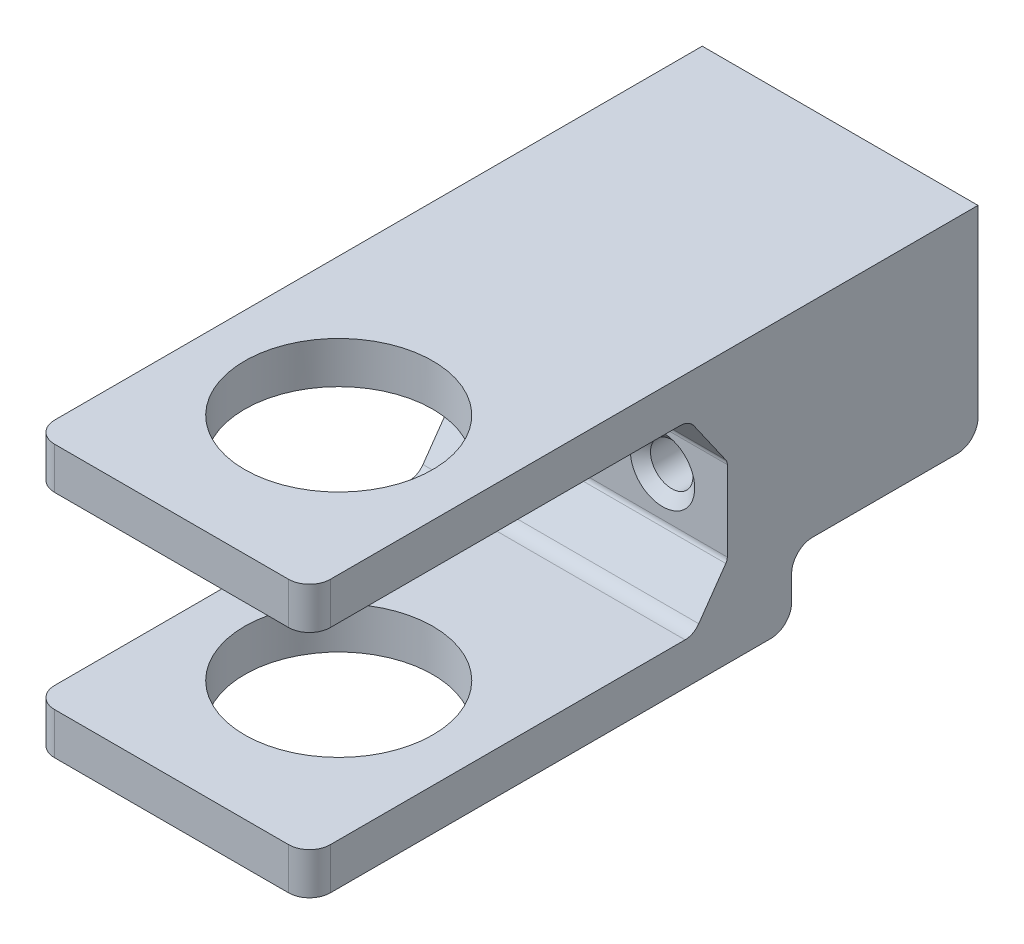
ISO-10303-21;
HEADER;
FILE_DESCRIPTION(('STEP AP214'),'2;1');
FILE_NAME('part.step','',(''),(''),'','','');
FILE_SCHEMA(('AUTOMOTIVE_DESIGN { 1 0 10303 214 1 1 1 1 }'));
ENDSEC;
DATA;
#1=APPLICATION_CONTEXT('core data for automotive mechanical design processes');
#2=APPLICATION_PROTOCOL_DEFINITION('international standard','automotive_design',2000,#1);
#3=PRODUCT_CONTEXT('',#1,'mechanical');
#4=PRODUCT('Part','Part','',(#3));
#5=PRODUCT_RELATED_PRODUCT_CATEGORY('part','',(#4));
#6=PRODUCT_DEFINITION_FORMATION('','',#4);
#7=PRODUCT_DEFINITION_CONTEXT('part definition',#1,'design');
#8=PRODUCT_DEFINITION('design','',#6,#7);
#9=PRODUCT_DEFINITION_SHAPE('','',#8);
#10=(LENGTH_UNIT() NAMED_UNIT(*) SI_UNIT(.MILLI.,.METRE.));
#11=(NAMED_UNIT(*) PLANE_ANGLE_UNIT() SI_UNIT($,.RADIAN.));
#12=(NAMED_UNIT(*) SI_UNIT($,.STERADIAN.) SOLID_ANGLE_UNIT());
#13=UNCERTAINTY_MEASURE_WITH_UNIT(LENGTH_MEASURE(1.E-05),#10,'distance_accuracy_value','');
#14=(GEOMETRIC_REPRESENTATION_CONTEXT(3) GLOBAL_UNCERTAINTY_ASSIGNED_CONTEXT((#13)) GLOBAL_UNIT_ASSIGNED_CONTEXT((#10,
#11,#12)) REPRESENTATION_CONTEXT('',''));
#15=CARTESIAN_POINT('',(0.,0.,0.));
#16=DIRECTION('',(0.,0.,1.));
#17=DIRECTION('',(1.,0.,0.));
#18=AXIS2_PLACEMENT_3D('',#15,#16,#17);
#19=CARTESIAN_POINT('',(20.955,41.275,50.8));
#20=DIRECTION('',(-1.,0.,0.));
#21=DIRECTION('',(0.,0.,1.));
#22=AXIS2_PLACEMENT_3D('',#19,#20,#21);
#23=PLANE('',#22);
#24=DIRECTION('',(0.,0.,-1.));
#25=VECTOR('',#24,1.);
#26=CARTESIAN_POINT('',(20.955,0.,50.8));
#27=LINE('',#26,#25);
#28=CARTESIAN_POINT('',(20.955,0.,47.625));
#29=VERTEX_POINT('',#28);
#30=CARTESIAN_POINT('',(20.955,0.,-19.304));
#31=VERTEX_POINT('',#30);
#32=EDGE_CURVE('E440',#29,#31,#27,.T.);
#33=ORIENTED_EDGE('',*,*,#32,.T.);
#34=CARTESIAN_POINT('',(20.955,3.175,-19.304));
#35=DIRECTION('',(-1.,0.,0.));
#36=DIRECTION('',(0.,0.,1.));
#37=AXIS2_PLACEMENT_3D('',#34,#35,#36);
#38=CIRCLE('',#37,3.175);
#39=CARTESIAN_POINT('',(20.955,3.175,-22.479));
#40=VERTEX_POINT('',#39);
#41=EDGE_CURVE('E279',#31,#40,#38,.F.);
#42=ORIENTED_EDGE('',*,*,#41,.T.);
#43=DIRECTION('',(0.,1.,0.));
#44=VECTOR('',#43,1.);
#45=CARTESIAN_POINT('',(20.955,0.,-22.479));
#46=LINE('',#45,#44);
#47=CARTESIAN_POINT('',(20.955,6.985,-22.479));
#48=VERTEX_POINT('',#47);
#49=EDGE_CURVE('E491',#40,#48,#46,.T.);
#50=ORIENTED_EDGE('',*,*,#49,.T.);
#51=CARTESIAN_POINT('',(20.955,6.985,-25.654));
#52=DIRECTION('',(-1.,0.,0.));
#53=DIRECTION('',(0.,0.,1.));
#54=AXIS2_PLACEMENT_3D('',#51,#52,#53);
#55=CIRCLE('',#54,3.175);
#56=CARTESIAN_POINT('',(20.955,10.16,-25.654));
#57=VERTEX_POINT('',#56);
#58=EDGE_CURVE('E328',#48,#57,#55,.T.);
#59=ORIENTED_EDGE('',*,*,#58,.T.);
#60=DIRECTION('',(0.,0.,-1.));
#61=VECTOR('',#60,1.);
#62=CARTESIAN_POINT('',(20.955,10.16,-50.8));
#63=LINE('',#62,#61);
#64=CARTESIAN_POINT('',(20.955,10.16,-47.625));
#65=VERTEX_POINT('',#64);
#66=EDGE_CURVE('E494',#57,#65,#63,.T.);
#67=ORIENTED_EDGE('',*,*,#66,.T.);
#68=CARTESIAN_POINT('',(20.955,13.335,-47.625));
#69=DIRECTION('',(-1.,0.,0.));
#70=DIRECTION('',(0.,0.,1.));
#71=AXIS2_PLACEMENT_3D('',#68,#69,#70);
#72=CIRCLE('',#71,3.175);
#73=CARTESIAN_POINT('',(20.955,13.335,-50.8));
#74=VERTEX_POINT('',#73);
#75=EDGE_CURVE('E227',#65,#74,#72,.F.);
#76=ORIENTED_EDGE('',*,*,#75,.T.);
#77=DIRECTION('',(0.,-1.,0.));
#78=VECTOR('',#77,1.);
#79=CARTESIAN_POINT('',(20.955,41.275,-50.8));
#80=LINE('',#79,#78);
#81=CARTESIAN_POINT('',(20.955,41.275,-50.8));
#82=VERTEX_POINT('',#81);
#83=EDGE_CURVE('E216',#82,#74,#80,.T.);
#84=ORIENTED_EDGE('',*,*,#83,.F.);
#85=DIRECTION('',(0.,0.,-1.));
#86=VECTOR('',#85,1.);
#87=CARTESIAN_POINT('',(20.955,41.275,50.8));
#88=LINE('',#87,#86);
#89=CARTESIAN_POINT('',(20.955,41.275,47.625));
#90=VERTEX_POINT('',#89);
#91=EDGE_CURVE('E196',#90,#82,#88,.T.);
#92=ORIENTED_EDGE('',*,*,#91,.F.);
#93=DIRECTION('',(0.,-1.,0.));
#94=VECTOR('',#93,1.);
#95=CARTESIAN_POINT('',(20.955,41.275,47.625));
#96=LINE('',#95,#94);
#97=CARTESIAN_POINT('',(20.955,34.925,47.625));
#98=VERTEX_POINT('',#97);
#99=EDGE_CURVE('E270',#90,#98,#96,.T.);
#100=ORIENTED_EDGE('',*,*,#99,.T.);
#101=DIRECTION('',(0.,0.,1.));
#102=VECTOR('',#101,1.);
#103=CARTESIAN_POINT('',(20.955,34.925,0.));
#104=LINE('',#103,#102);
#105=CARTESIAN_POINT('',(20.955,34.925,-5.55022309827195));
#106=VERTEX_POINT('',#105);
#107=EDGE_CURVE('E518',#106,#98,#104,.T.);
#108=ORIENTED_EDGE('',*,*,#107,.F.);
#109=CARTESIAN_POINT('',(20.955,32.385,-5.55022309827195));
#110=DIRECTION('',(-1.,0.,0.));
#111=DIRECTION('',(0.,0.,1.));
#112=AXIS2_PLACEMENT_3D('',#109,#110,#111);
#113=CIRCLE('',#112,2.54);
#114=CARTESIAN_POINT('',(20.955,33.8418841483317,-7.63086929076599));
#115=VERTEX_POINT('',#114);
#116=EDGE_CURVE('E367',#106,#115,#113,.T.);
#117=ORIENTED_EDGE('',*,*,#116,.T.);
#118=DIRECTION('',(0.,0.819152044288993,0.573576436351044));
#119=VECTOR('',#118,1.);
#120=CARTESIAN_POINT('',(20.955,14.7189748221115,-21.020874553486));
#121=LINE('',#120,#119);
#122=CARTESIAN_POINT('',(20.955,26.9304278423133,-12.470323096247));
#123=VERTEX_POINT('',#122);
#124=EDGE_CURVE('E425',#123,#115,#121,.T.);
#125=ORIENTED_EDGE('',*,*,#124,.F.);
#126=CARTESIAN_POINT('',(20.955,26.2019857681475,-11.43));
#127=DIRECTION('',(-1.,0.,0.));
#128=DIRECTION('',(0.,0.,1.));
#129=AXIS2_PLACEMENT_3D('',#126,#127,#128);
#130=CIRCLE('',#129,1.27);
#131=CARTESIAN_POINT('',(20.955,26.2019857681475,-12.7));
#132=VERTEX_POINT('',#131);
#133=EDGE_CURVE('E11',#123,#132,#130,.T.);
#134=ORIENTED_EDGE('',*,*,#133,.T.);
#135=DIRECTION('',(0.,-1.,0.));
#136=VECTOR('',#135,1.);
#137=CARTESIAN_POINT('',(20.955,0.,-12.7));
#138=LINE('',#137,#136);
#139=CARTESIAN_POINT('',(20.955,14.0326911356055,-12.7));
#140=VERTEX_POINT('',#139);
#141=EDGE_CURVE('E395',#132,#140,#138,.T.);
#142=ORIENTED_EDGE('',*,*,#141,.T.);
#143=CARTESIAN_POINT('',(20.955,14.0326911356055,-11.43));
#144=DIRECTION('',(-1.,0.,0.));
#145=DIRECTION('',(0.,0.,1.));
#146=AXIS2_PLACEMENT_3D('',#143,#144,#145);
#147=CIRCLE('',#146,1.27);
#148=CARTESIAN_POINT('',(20.955,13.3042490614396,-12.470323096247));
#149=VERTEX_POINT('',#148);
#150=EDGE_CURVE('E387',#140,#149,#147,.T.);
#151=ORIENTED_EDGE('',*,*,#150,.T.);
#152=DIRECTION('',(0.,-0.819152044288993,0.573576436351044));
#153=VECTOR('',#152,1.);
#154=CARTESIAN_POINT('',(20.955,-1.4821713508769,-2.11676006040512));
#155=LINE('',#154,#153);
#156=CARTESIAN_POINT('',(20.955,7.43311585166835,-8.35931136493182));
#157=VERTEX_POINT('',#156);
#158=EDGE_CURVE('E393',#149,#157,#155,.T.);
#159=ORIENTED_EDGE('',*,*,#158,.T.);
#160=CARTESIAN_POINT('',(20.955,8.89,-6.27866517243778));
#161=DIRECTION('',(-1.,0.,0.));
#162=DIRECTION('',(0.,0.,1.));
#163=AXIS2_PLACEMENT_3D('',#160,#161,#162);
#164=CIRCLE('',#163,2.54);
#165=CARTESIAN_POINT('',(20.955,6.35,-6.27866517243778));
#166=VERTEX_POINT('',#165);
#167=EDGE_CURVE('E361',#157,#166,#164,.T.);
#168=ORIENTED_EDGE('',*,*,#167,.T.);
#169=DIRECTION('',(0.,0.,1.));
#170=VECTOR('',#169,1.);
#171=CARTESIAN_POINT('',(20.955,6.35,0.));
#172=LINE('',#171,#170);
#173=CARTESIAN_POINT('',(20.955,6.35,47.625));
#174=VERTEX_POINT('',#173);
#175=EDGE_CURVE('E405',#166,#174,#172,.T.);
#176=ORIENTED_EDGE('',*,*,#175,.T.);
#177=DIRECTION('',(0.,-1.,0.));
#178=VECTOR('',#177,1.);
#179=CARTESIAN_POINT('',(20.955,41.275,47.625));
#180=LINE('',#179,#178);
#181=EDGE_CURVE('E273',#174,#29,#180,.T.);
#182=ORIENTED_EDGE('',*,*,#181,.T.);
#183=EDGE_LOOP('',(#33,#42,#50,#59,#67,#76,#84,#92,#100,#108,#117,#125,#134,#142,#151,#159,#168,
#176,#182));
#184=FACE_BOUND('',#183,.T.);
#185=ADVANCED_FACE('F43',(#184),#23,.F.);
#186=CARTESIAN_POINT('',(-20.955,41.275,50.8));
#187=DIRECTION('',(1.,0.,0.));
#188=DIRECTION('',(0.,0.,-1.));
#189=AXIS2_PLACEMENT_3D('',#186,#187,#188);
#190=PLANE('',#189);
#191=DIRECTION('',(0.,1.,0.));
#192=VECTOR('',#191,1.);
#193=CARTESIAN_POINT('',(-20.955,0.,-22.479));
#194=LINE('',#193,#192);
#195=CARTESIAN_POINT('',(-20.955,3.175,-22.479));
#196=VERTEX_POINT('',#195);
#197=CARTESIAN_POINT('',(-20.955,6.985,-22.479));
#198=VERTEX_POINT('',#197);
#199=EDGE_CURVE('E481',#196,#198,#194,.T.);
#200=ORIENTED_EDGE('',*,*,#199,.F.);
#201=CARTESIAN_POINT('',(-20.955,3.175,-19.304));
#202=DIRECTION('',(1.,0.,0.));
#203=DIRECTION('',(0.,0.,-1.));
#204=AXIS2_PLACEMENT_3D('',#201,#202,#203);
#205=CIRCLE('',#204,3.175);
#206=CARTESIAN_POINT('',(-20.955,0.,-19.304));
#207=VERTEX_POINT('',#206);
#208=EDGE_CURVE('E258',#196,#207,#205,.F.);
#209=ORIENTED_EDGE('',*,*,#208,.T.);
#210=DIRECTION('',(0.,0.,1.));
#211=VECTOR('',#210,1.);
#212=CARTESIAN_POINT('',(-20.955,0.,50.8));
#213=LINE('',#212,#211);
#214=CARTESIAN_POINT('',(-20.955,0.,47.625));
#215=VERTEX_POINT('',#214);
#216=EDGE_CURVE('E451',#207,#215,#213,.T.);
#217=ORIENTED_EDGE('',*,*,#216,.T.);
#218=DIRECTION('',(0.,-1.,0.));
#219=VECTOR('',#218,1.);
#220=CARTESIAN_POINT('',(-20.955,41.275,47.625));
#221=LINE('',#220,#219);
#222=CARTESIAN_POINT('',(-20.955,6.35,47.625));
#223=VERTEX_POINT('',#222);
#224=EDGE_CURVE('E251',#215,#223,#221,.F.);
#225=ORIENTED_EDGE('',*,*,#224,.T.);
#226=DIRECTION('',(0.,0.,1.));
#227=VECTOR('',#226,1.);
#228=CARTESIAN_POINT('',(-20.955,6.35,0.));
#229=LINE('',#228,#227);
#230=CARTESIAN_POINT('',(-20.955,6.35,-6.27866517243778));
#231=VERTEX_POINT('',#230);
#232=EDGE_CURVE('E420',#231,#223,#229,.T.);
#233=ORIENTED_EDGE('',*,*,#232,.F.);
#234=CARTESIAN_POINT('',(-20.955,8.89,-6.27866517243778));
#235=DIRECTION('',(1.,0.,0.));
#236=DIRECTION('',(0.,0.,-1.));
#237=AXIS2_PLACEMENT_3D('',#234,#235,#236);
#238=CIRCLE('',#237,2.54);
#239=CARTESIAN_POINT('',(-20.955,7.43311585166835,-8.35931136493182));
#240=VERTEX_POINT('',#239);
#241=EDGE_CURVE('E357',#231,#240,#238,.T.);
#242=ORIENTED_EDGE('',*,*,#241,.T.);
#243=DIRECTION('',(0.,-0.819152044288993,0.573576436351044));
#244=VECTOR('',#243,1.);
#245=CARTESIAN_POINT('',(-20.955,-1.4821713508769,-2.11676006040512));
#246=LINE('',#245,#244);
#247=CARTESIAN_POINT('',(-20.955,13.3042490614396,-12.470323096247));
#248=VERTEX_POINT('',#247);
#249=EDGE_CURVE('E412',#248,#240,#246,.T.);
#250=ORIENTED_EDGE('',*,*,#249,.F.);
#251=CARTESIAN_POINT('',(-20.955,14.0326911356055,-11.43));
#252=DIRECTION('',(1.,0.,0.));
#253=DIRECTION('',(0.,0.,-1.));
#254=AXIS2_PLACEMENT_3D('',#251,#252,#253);
#255=CIRCLE('',#254,1.27);
#256=CARTESIAN_POINT('',(-20.955,14.0326911356055,-12.7));
#257=VERTEX_POINT('',#256);
#258=EDGE_CURVE('E384',#248,#257,#255,.T.);
#259=ORIENTED_EDGE('',*,*,#258,.T.);
#260=DIRECTION('',(0.,-1.,0.));
#261=VECTOR('',#260,1.);
#262=CARTESIAN_POINT('',(-20.955,0.,-12.7));
#263=LINE('',#262,#261);
#264=CARTESIAN_POINT('',(-20.955,26.2019857681475,-12.7));
#265=VERTEX_POINT('',#264);
#266=EDGE_CURVE('E411',#265,#257,#263,.T.);
#267=ORIENTED_EDGE('',*,*,#266,.F.);
#268=CARTESIAN_POINT('',(-20.955,26.2019857681475,-11.43));
#269=DIRECTION('',(1.,0.,0.));
#270=DIRECTION('',(0.,0.,-1.));
#271=AXIS2_PLACEMENT_3D('',#268,#269,#270);
#272=CIRCLE('',#271,1.27);
#273=CARTESIAN_POINT('',(-20.955,26.9304278423133,-12.470323096247));
#274=VERTEX_POINT('',#273);
#275=EDGE_CURVE('E52',#265,#274,#272,.T.);
#276=ORIENTED_EDGE('',*,*,#275,.T.);
#277=DIRECTION('',(0.,0.819152044288993,0.573576436351044));
#278=VECTOR('',#277,1.);
#279=CARTESIAN_POINT('',(-20.955,14.7189748221115,-21.020874553486));
#280=LINE('',#279,#278);
#281=CARTESIAN_POINT('',(-20.955,33.8418841483317,-7.63086929076599));
#282=VERTEX_POINT('',#281);
#283=EDGE_CURVE('E433',#274,#282,#280,.T.);
#284=ORIENTED_EDGE('',*,*,#283,.T.);
#285=CARTESIAN_POINT('',(-20.955,32.385,-5.55022309827195));
#286=DIRECTION('',(1.,0.,0.));
#287=DIRECTION('',(0.,0.,-1.));
#288=AXIS2_PLACEMENT_3D('',#285,#286,#287);
#289=CIRCLE('',#288,2.54);
#290=CARTESIAN_POINT('',(-20.955,34.925,-5.55022309827195));
#291=VERTEX_POINT('',#290);
#292=EDGE_CURVE('E364',#282,#291,#289,.T.);
#293=ORIENTED_EDGE('',*,*,#292,.T.);
#294=DIRECTION('',(0.,0.,1.));
#295=VECTOR('',#294,1.);
#296=CARTESIAN_POINT('',(-20.955,34.925,0.));
#297=LINE('',#296,#295);
#298=CARTESIAN_POINT('',(-20.955,34.925,47.625));
#299=VERTEX_POINT('',#298);
#300=EDGE_CURVE('E430',#291,#299,#297,.T.);
#301=ORIENTED_EDGE('',*,*,#300,.T.);
#302=DIRECTION('',(0.,-1.,0.));
#303=VECTOR('',#302,1.);
#304=CARTESIAN_POINT('',(-20.955,41.275,47.625));
#305=LINE('',#304,#303);
#306=CARTESIAN_POINT('',(-20.955,41.275,47.625));
#307=VERTEX_POINT('',#306);
#308=EDGE_CURVE('E248',#299,#307,#305,.F.);
#309=ORIENTED_EDGE('',*,*,#308,.T.);
#310=DIRECTION('',(0.,0.,1.));
#311=VECTOR('',#310,1.);
#312=CARTESIAN_POINT('',(-20.955,41.275,50.8));
#313=LINE('',#312,#311);
#314=CARTESIAN_POINT('',(-20.955,41.275,-50.8));
#315=VERTEX_POINT('',#314);
#316=EDGE_CURVE('E222',#315,#307,#313,.T.);
#317=ORIENTED_EDGE('',*,*,#316,.F.);
#318=DIRECTION('',(0.,-1.,0.));
#319=VECTOR('',#318,1.);
#320=CARTESIAN_POINT('',(-20.955,41.275,-50.8));
#321=LINE('',#320,#319);
#322=CARTESIAN_POINT('',(-20.955,13.335,-50.8));
#323=VERTEX_POINT('',#322);
#324=EDGE_CURVE('E219',#315,#323,#321,.T.);
#325=ORIENTED_EDGE('',*,*,#324,.T.);
#326=CARTESIAN_POINT('',(-20.955,13.335,-47.625));
#327=DIRECTION('',(1.,0.,0.));
#328=DIRECTION('',(0.,0.,-1.));
#329=AXIS2_PLACEMENT_3D('',#326,#327,#328);
#330=CIRCLE('',#329,3.175);
#331=CARTESIAN_POINT('',(-20.955,10.16,-47.625));
#332=VERTEX_POINT('',#331);
#333=EDGE_CURVE('E255',#323,#332,#330,.F.);
#334=ORIENTED_EDGE('',*,*,#333,.T.);
#335=DIRECTION('',(0.,0.,-1.));
#336=VECTOR('',#335,1.);
#337=CARTESIAN_POINT('',(-20.955,10.16,-50.8));
#338=LINE('',#337,#336);
#339=CARTESIAN_POINT('',(-20.955,10.16,-25.654));
#340=VERTEX_POINT('',#339);
#341=EDGE_CURVE('E495',#340,#332,#338,.T.);
#342=ORIENTED_EDGE('',*,*,#341,.F.);
#343=CARTESIAN_POINT('',(-20.955,6.985,-25.654));
#344=DIRECTION('',(1.,0.,0.));
#345=DIRECTION('',(0.,0.,-1.));
#346=AXIS2_PLACEMENT_3D('',#343,#344,#345);
#347=CIRCLE('',#346,3.175);
#348=EDGE_CURVE('E325',#340,#198,#347,.T.);
#349=ORIENTED_EDGE('',*,*,#348,.T.);
#350=EDGE_LOOP('',(#200,#209,#217,#225,#233,#242,#250,#259,#267,#276,#284,#293,#301,#309,#317,
#325,#334,#342,#349));
#351=FACE_BOUND('',#350,.T.);
#352=ADVANCED_FACE('F410',(#351),#190,.F.);
#353=CARTESIAN_POINT('',(-20.955,41.275,50.8));
#354=DIRECTION('',(0.,0.,-1.));
#355=DIRECTION('',(-1.,0.,0.));
#356=AXIS2_PLACEMENT_3D('',#353,#354,#355);
#357=PLANE('',#356);
#358=DIRECTION('',(1.,0.,0.));
#359=VECTOR('',#358,1.);
#360=CARTESIAN_POINT('',(-20.955,41.275,50.8));
#361=LINE('',#360,#359);
#362=CARTESIAN_POINT('',(-17.78,41.275,50.8));
#363=VERTEX_POINT('',#362);
#364=CARTESIAN_POINT('',(17.78,41.275,50.8));
#365=VERTEX_POINT('',#364);
#366=EDGE_CURVE('E235',#363,#365,#361,.T.);
#367=ORIENTED_EDGE('',*,*,#366,.F.);
#368=DIRECTION('',(0.,-1.,0.));
#369=VECTOR('',#368,1.);
#370=CARTESIAN_POINT('',(-17.78,41.275,50.8));
#371=LINE('',#370,#369);
#372=CARTESIAN_POINT('',(-17.78,34.925,50.8));
#373=VERTEX_POINT('',#372);
#374=EDGE_CURVE('E309',#363,#373,#371,.T.);
#375=ORIENTED_EDGE('',*,*,#374,.T.);
#376=DIRECTION('',(-1.,0.,0.));
#377=VECTOR('',#376,1.);
#378=CARTESIAN_POINT('',(20.955,34.925,50.8));
#379=LINE('',#378,#377);
#380=CARTESIAN_POINT('',(17.78,34.925,50.8));
#381=VERTEX_POINT('',#380);
#382=EDGE_CURVE('E436',#381,#373,#379,.T.);
#383=ORIENTED_EDGE('',*,*,#382,.F.);
#384=DIRECTION('',(0.,-1.,0.));
#385=VECTOR('',#384,1.);
#386=CARTESIAN_POINT('',(17.78,41.275,50.8));
#387=LINE('',#386,#385);
#388=EDGE_CURVE('E306',#381,#365,#387,.F.);
#389=ORIENTED_EDGE('',*,*,#388,.T.);
#390=EDGE_LOOP('',(#367,#375,#383,#389));
#391=FACE_BOUND('',#390,.T.);
#392=ADVANCED_FACE('F542',(#391),#357,.F.);
#393=CARTESIAN_POINT('',(-20.955,41.275,-50.8));
#394=DIRECTION('',(0.,0.,1.));
#395=DIRECTION('',(1.,0.,0.));
#396=AXIS2_PLACEMENT_3D('',#393,#394,#395);
#397=PLANE('',#396);
#398=CARTESIAN_POINT('',(-11.1125,20.6375,-50.8));
#399=DIRECTION('',(0.,0.,-1.));
#400=DIRECTION('',(-1.,0.,0.));
#401=AXIS2_PLACEMENT_3D('',#398,#399,#400);
#402=CIRCLE('',#401,3.2258);
#403=CARTESIAN_POINT('',(-14.3383,20.6375,-50.8));
#404=VERTEX_POINT('',#403);
#405=EDGE_CURVE('E507',#404,#404,#402,.T.);
#406=ORIENTED_EDGE('',*,*,#405,.F.);
#407=EDGE_LOOP('',(#406));
#408=FACE_BOUND('',#407,.T.);
#409=CARTESIAN_POINT('',(11.1125,20.6375,-50.8));
#410=DIRECTION('',(0.,0.,-1.));
#411=DIRECTION('',(-1.,0.,0.));
#412=AXIS2_PLACEMENT_3D('',#409,#410,#411);
#413=CIRCLE('',#412,3.2258);
#414=CARTESIAN_POINT('',(7.88669999999999,20.6375,-50.8));
#415=VERTEX_POINT('',#414);
#416=EDGE_CURVE('E336',#415,#415,#413,.T.);
#417=ORIENTED_EDGE('',*,*,#416,.F.);
#418=EDGE_LOOP('',(#417));
#419=FACE_BOUND('',#418,.T.);
#420=ORIENTED_EDGE('',*,*,#83,.T.);
#421=DIRECTION('',(-1.,0.,0.));
#422=VECTOR('',#421,1.);
#423=CARTESIAN_POINT('',(-20.955,13.335,-50.8));
#424=LINE('',#423,#422);
#425=EDGE_CURVE('E289',#74,#323,#424,.T.);
#426=ORIENTED_EDGE('',*,*,#425,.T.);
#427=ORIENTED_EDGE('',*,*,#324,.F.);
#428=DIRECTION('',(-1.,0.,0.));
#429=VECTOR('',#428,1.);
#430=CARTESIAN_POINT('',(-20.955,41.275,-50.8));
#431=LINE('',#430,#429);
#432=EDGE_CURVE('E200',#82,#315,#431,.T.);
#433=ORIENTED_EDGE('',*,*,#432,.F.);
#434=EDGE_LOOP('',(#420,#426,#427,#433));
#435=FACE_BOUND('',#434,.T.);
#436=ADVANCED_FACE('F214',(#408,#419,#435),#397,.F.);
#437=DIRECTION('',(-1.,0.,0.));
#438=VECTOR('',#437,1.);
#439=CARTESIAN_POINT('',(20.955,6.35,50.8));
#440=LINE('',#439,#438);
#441=CARTESIAN_POINT('',(17.78,6.35,50.8));
#442=VERTEX_POINT('',#441);
#443=CARTESIAN_POINT('',(-17.78,6.35,50.8));
#444=VERTEX_POINT('',#443);
#445=EDGE_CURVE('E441',#442,#444,#440,.T.);
#446=ORIENTED_EDGE('',*,*,#445,.T.);
#447=DIRECTION('',(0.,-1.,0.));
#448=VECTOR('',#447,1.);
#449=CARTESIAN_POINT('',(-17.78,41.275,50.8));
#450=LINE('',#449,#448);
#451=CARTESIAN_POINT('',(-17.78,0.,50.8));
#452=VERTEX_POINT('',#451);
#453=EDGE_CURVE('E295',#444,#452,#450,.T.);
#454=ORIENTED_EDGE('',*,*,#453,.T.);
#455=DIRECTION('',(1.,0.,0.));
#456=VECTOR('',#455,1.);
#457=CARTESIAN_POINT('',(-20.955,0.,50.8));
#458=LINE('',#457,#456);
#459=CARTESIAN_POINT('',(17.78,0.,50.8));
#460=VERTEX_POINT('',#459);
#461=EDGE_CURVE('E210',#452,#460,#458,.T.);
#462=ORIENTED_EDGE('',*,*,#461,.T.);
#463=DIRECTION('',(0.,-1.,0.));
#464=VECTOR('',#463,1.);
#465=CARTESIAN_POINT('',(17.78,41.275,50.8));
#466=LINE('',#465,#464);
#467=EDGE_CURVE('E292',#460,#442,#466,.F.);
#468=ORIENTED_EDGE('',*,*,#467,.T.);
#469=EDGE_LOOP('',(#446,#454,#462,#468));
#470=FACE_BOUND('',#469,.T.);
#471=ADVANCED_FACE('F459',(#470),#357,.F.);
#472=CARTESIAN_POINT('',(0.,41.275,0.));
#473=DIRECTION('',(0.,-1.,0.));
#474=DIRECTION('',(0.,0.,-1.));
#475=AXIS2_PLACEMENT_3D('',#472,#473,#474);
#476=PLANE('',#475);
#477=CARTESIAN_POINT('',(0.,41.275,25.4));
#478=DIRECTION('',(0.,1.,0.));
#479=DIRECTION('',(0.,0.,1.));
#480=AXIS2_PLACEMENT_3D('',#477,#478,#479);
#481=CIRCLE('',#480,14.3002);
#482=CARTESIAN_POINT('',(0.,41.275,39.7002));
#483=VERTEX_POINT('',#482);
#484=EDGE_CURVE('E499',#483,#483,#481,.T.);
#485=ORIENTED_EDGE('',*,*,#484,.F.);
#486=EDGE_LOOP('',(#485));
#487=FACE_BOUND('',#486,.T.);
#488=ORIENTED_EDGE('',*,*,#316,.T.);
#489=CARTESIAN_POINT('',(-17.78,41.275,47.625));
#490=DIRECTION('',(0.,-1.,0.));
#491=DIRECTION('',(0.,0.,-1.));
#492=AXIS2_PLACEMENT_3D('',#489,#490,#491);
#493=CIRCLE('',#492,3.175);
#494=EDGE_CURVE('E322',#307,#363,#493,.F.);
#495=ORIENTED_EDGE('',*,*,#494,.T.);
#496=ORIENTED_EDGE('',*,*,#366,.T.);
#497=CARTESIAN_POINT('',(17.78,41.275,47.625));
#498=DIRECTION('',(0.,-1.,0.));
#499=DIRECTION('',(0.,0.,-1.));
#500=AXIS2_PLACEMENT_3D('',#497,#498,#499);
#501=CIRCLE('',#500,3.175);
#502=EDGE_CURVE('E204',#365,#90,#501,.F.);
#503=ORIENTED_EDGE('',*,*,#502,.T.);
#504=ORIENTED_EDGE('',*,*,#91,.T.);
#505=ORIENTED_EDGE('',*,*,#432,.T.);
#506=EDGE_LOOP('',(#488,#495,#496,#503,#504,#505));
#507=FACE_BOUND('',#506,.T.);
#508=ADVANCED_FACE('F199',(#487,#507),#476,.F.);
#509=CARTESIAN_POINT('',(0.,0.,0.));
#510=DIRECTION('',(0.,-1.,0.));
#511=DIRECTION('',(0.,0.,-1.));
#512=AXIS2_PLACEMENT_3D('',#509,#510,#511);
#513=PLANE('',#512);
#514=ORIENTED_EDGE('',*,*,#216,.F.);
#515=DIRECTION('',(-1.,0.,0.));
#516=VECTOR('',#515,1.);
#517=CARTESIAN_POINT('',(20.955,0.,-19.304));
#518=LINE('',#517,#516);
#519=EDGE_CURVE('E267',#207,#31,#518,.F.);
#520=ORIENTED_EDGE('',*,*,#519,.T.);
#521=ORIENTED_EDGE('',*,*,#32,.F.);
#522=CARTESIAN_POINT('',(17.78,0.,47.625));
#523=DIRECTION('',(0.,-1.,0.));
#524=DIRECTION('',(0.,0.,-1.));
#525=AXIS2_PLACEMENT_3D('',#522,#523,#524);
#526=CIRCLE('',#525,3.175);
#527=EDGE_CURVE('E261',#29,#460,#526,.T.);
#528=ORIENTED_EDGE('',*,*,#527,.T.);
#529=ORIENTED_EDGE('',*,*,#461,.F.);
#530=CARTESIAN_POINT('',(-17.78,0.,47.625));
#531=DIRECTION('',(0.,-1.,0.));
#532=DIRECTION('',(0.,0.,-1.));
#533=AXIS2_PLACEMENT_3D('',#530,#531,#532);
#534=CIRCLE('',#533,3.175);
#535=EDGE_CURVE('E264',#452,#215,#534,.T.);
#536=ORIENTED_EDGE('',*,*,#535,.T.);
#537=EDGE_LOOP('',(#514,#520,#521,#528,#529,#536));
#538=FACE_BOUND('',#537,.T.);
#539=CARTESIAN_POINT('',(0.,0.,25.4));
#540=DIRECTION('',(0.,1.,0.));
#541=DIRECTION('',(0.,0.,1.));
#542=AXIS2_PLACEMENT_3D('',#539,#540,#541);
#543=CIRCLE('',#542,14.3002);
#544=CARTESIAN_POINT('',(0.,0.,39.7002));
#545=VERTEX_POINT('',#544);
#546=EDGE_CURVE('E243',#545,#545,#543,.T.);
#547=ORIENTED_EDGE('',*,*,#546,.T.);
#548=EDGE_LOOP('',(#547));
#549=FACE_BOUND('',#548,.T.);
#550=ADVANCED_FACE('F476',(#538,#549),#513,.T.);
#551=CARTESIAN_POINT('',(20.955,0.,-12.7));
#552=DIRECTION('',(0.,0.,-1.));
#553=DIRECTION('',(0.,1.,0.));
#554=AXIS2_PLACEMENT_3D('',#551,#552,#553);
#555=PLANE('',#554);
#556=CARTESIAN_POINT('',(-11.1125,20.6375,-12.7));
#557=DIRECTION('',(0.,0.,1.));
#558=DIRECTION('',(1.,0.,0.));
#559=AXIS2_PLACEMENT_3D('',#556,#557,#558);
#560=CIRCLE('',#559,4.8895);
#561=CARTESIAN_POINT('',(-6.22300000000001,20.6375,-12.7));
#562=VERTEX_POINT('',#561);
#563=EDGE_CURVE('E342',#562,#562,#560,.T.);
#564=ORIENTED_EDGE('',*,*,#563,.F.);
#565=EDGE_LOOP('',(#564));
#566=FACE_BOUND('',#565,.T.);
#567=CARTESIAN_POINT('',(11.1125,20.6375,-12.7));
#568=DIRECTION('',(0.,0.,1.));
#569=DIRECTION('',(1.,0.,0.));
#570=AXIS2_PLACEMENT_3D('',#567,#568,#569);
#571=CIRCLE('',#570,4.8895);
#572=CARTESIAN_POINT('',(16.002,20.6375,-12.7));
#573=VERTEX_POINT('',#572);
#574=EDGE_CURVE('E337',#573,#573,#571,.T.);
#575=ORIENTED_EDGE('',*,*,#574,.F.);
#576=EDGE_LOOP('',(#575));
#577=FACE_BOUND('',#576,.T.);
#578=ORIENTED_EDGE('',*,*,#266,.T.);
#579=DIRECTION('',(-1.,0.,0.));
#580=VECTOR('',#579,1.);
#581=CARTESIAN_POINT('',(20.955,14.0326911356055,-12.7));
#582=LINE('',#581,#580);
#583=EDGE_CURVE('E379',#257,#140,#582,.F.);
#584=ORIENTED_EDGE('',*,*,#583,.T.);
#585=ORIENTED_EDGE('',*,*,#141,.F.);
#586=DIRECTION('',(-1.,0.,0.));
#587=VECTOR('',#586,1.);
#588=CARTESIAN_POINT('',(20.955,26.2019857681475,-12.7));
#589=LINE('',#588,#587);
#590=EDGE_CURVE('E375',#132,#265,#589,.T.);
#591=ORIENTED_EDGE('',*,*,#590,.T.);
#592=EDGE_LOOP('',(#578,#584,#585,#591));
#593=FACE_BOUND('',#592,.T.);
#594=ADVANCED_FACE('F414',(#566,#577,#593),#555,.F.);
#595=CARTESIAN_POINT('',(20.955,14.7189748221115,-21.020874553486));
#596=DIRECTION('',(0.,-0.573576436351044,0.819152044288993));
#597=DIRECTION('',(0.,-0.819152044288993,-0.573576436351044));
#598=AXIS2_PLACEMENT_3D('',#595,#596,#597);
#599=PLANE('',#598);
#600=ORIENTED_EDGE('',*,*,#283,.F.);
#601=DIRECTION('',(-1.,0.,0.));
#602=VECTOR('',#601,1.);
#603=CARTESIAN_POINT('',(20.955,26.9304278423133,-12.470323096247));
#604=LINE('',#603,#602);
#605=EDGE_CURVE('E65',#274,#123,#604,.F.);
#606=ORIENTED_EDGE('',*,*,#605,.T.);
#607=ORIENTED_EDGE('',*,*,#124,.T.);
#608=DIRECTION('',(-1.,0.,0.));
#609=VECTOR('',#608,1.);
#610=CARTESIAN_POINT('',(-20.955,33.8418841483317,-7.63086929076599));
#611=LINE('',#610,#609);
#612=EDGE_CURVE('E350',#115,#282,#611,.T.);
#613=ORIENTED_EDGE('',*,*,#612,.T.);
#614=EDGE_LOOP('',(#600,#606,#607,#613));
#615=FACE_BOUND('',#614,.T.);
#616=ADVANCED_FACE('F524',(#615),#599,.T.);
#617=CARTESIAN_POINT('',(20.955,34.925,0.));
#618=DIRECTION('',(0.,-1.,0.));
#619=DIRECTION('',(0.,0.,-1.));
#620=AXIS2_PLACEMENT_3D('',#617,#618,#619);
#621=PLANE('',#620);
#622=CARTESIAN_POINT('',(0.,34.925,25.4));
#623=DIRECTION('',(0.,-1.,0.));
#624=DIRECTION('',(0.,0.,-1.));
#625=AXIS2_PLACEMENT_3D('',#622,#623,#624);
#626=CIRCLE('',#625,14.3002);
#627=CARTESIAN_POINT('',(0.,34.925,11.0998));
#628=VERTEX_POINT('',#627);
#629=EDGE_CURVE('E242',#628,#628,#626,.T.);
#630=ORIENTED_EDGE('',*,*,#629,.F.);
#631=EDGE_LOOP('',(#630));
#632=FACE_BOUND('',#631,.T.);
#633=ORIENTED_EDGE('',*,*,#300,.F.);
#634=DIRECTION('',(-1.,0.,0.));
#635=VECTOR('',#634,1.);
#636=CARTESIAN_POINT('',(20.955,34.925,-5.55022309827195));
#637=LINE('',#636,#635);
#638=EDGE_CURVE('E354',#291,#106,#637,.F.);
#639=ORIENTED_EDGE('',*,*,#638,.T.);
#640=ORIENTED_EDGE('',*,*,#107,.T.);
#641=CARTESIAN_POINT('',(17.78,34.925,47.625));
#642=DIRECTION('',(0.,-1.,0.));
#643=DIRECTION('',(0.,0.,-1.));
#644=AXIS2_PLACEMENT_3D('',#641,#642,#643);
#645=CIRCLE('',#644,3.175);
#646=EDGE_CURVE('E313',#98,#381,#645,.T.);
#647=ORIENTED_EDGE('',*,*,#646,.T.);
#648=ORIENTED_EDGE('',*,*,#382,.T.);
#649=CARTESIAN_POINT('',(-17.78,34.925,47.625));
#650=DIRECTION('',(0.,-1.,0.));
#651=DIRECTION('',(0.,0.,-1.));
#652=AXIS2_PLACEMENT_3D('',#649,#650,#651);
#653=CIRCLE('',#652,3.175);
#654=EDGE_CURVE('E316',#373,#299,#653,.T.);
#655=ORIENTED_EDGE('',*,*,#654,.T.);
#656=EDGE_LOOP('',(#633,#639,#640,#647,#648,#655));
#657=FACE_BOUND('',#656,.T.);
#658=ADVANCED_FACE('F533',(#632,#657),#621,.T.);
#659=CARTESIAN_POINT('',(20.955,6.35,0.));
#660=DIRECTION('',(0.,-1.,0.));
#661=DIRECTION('',(0.,0.,-1.));
#662=AXIS2_PLACEMENT_3D('',#659,#660,#661);
#663=PLANE('',#662);
#664=CARTESIAN_POINT('',(0.,6.35,25.4));
#665=DIRECTION('',(0.,-1.,0.));
#666=DIRECTION('',(0.,0.,-1.));
#667=AXIS2_PLACEMENT_3D('',#664,#665,#666);
#668=CIRCLE('',#667,14.3002);
#669=CARTESIAN_POINT('',(0.,6.35,11.0998));
#670=VERTEX_POINT('',#669);
#671=EDGE_CURVE('E239',#670,#670,#668,.T.);
#672=ORIENTED_EDGE('',*,*,#671,.T.);
#673=EDGE_LOOP('',(#672));
#674=FACE_BOUND('',#673,.T.);
#675=ORIENTED_EDGE('',*,*,#175,.F.);
#676=DIRECTION('',(-1.,0.,0.));
#677=VECTOR('',#676,1.);
#678=CARTESIAN_POINT('',(-20.955,6.35,-6.27866517243778));
#679=LINE('',#678,#677);
#680=EDGE_CURVE('E331',#166,#231,#679,.T.);
#681=ORIENTED_EDGE('',*,*,#680,.T.);
#682=ORIENTED_EDGE('',*,*,#232,.T.);
#683=CARTESIAN_POINT('',(-17.78,6.35,47.625));
#684=DIRECTION('',(0.,-1.,0.));
#685=DIRECTION('',(0.,0.,-1.));
#686=AXIS2_PLACEMENT_3D('',#683,#684,#685);
#687=CIRCLE('',#686,3.175);
#688=EDGE_CURVE('E303',#223,#444,#687,.F.);
#689=ORIENTED_EDGE('',*,*,#688,.T.);
#690=ORIENTED_EDGE('',*,*,#445,.F.);
#691=CARTESIAN_POINT('',(17.78,6.35,47.625));
#692=DIRECTION('',(0.,-1.,0.));
#693=DIRECTION('',(0.,0.,-1.));
#694=AXIS2_PLACEMENT_3D('',#691,#692,#693);
#695=CIRCLE('',#694,3.175);
#696=EDGE_CURVE('E299',#442,#174,#695,.F.);
#697=ORIENTED_EDGE('',*,*,#696,.T.);
#698=EDGE_LOOP('',(#675,#681,#682,#689,#690,#697));
#699=FACE_BOUND('',#698,.T.);
#700=ADVANCED_FACE('F469',(#674,#699),#663,.F.);
#701=CARTESIAN_POINT('',(20.955,-1.4821713508769,-2.11676006040512));
#702=DIRECTION('',(0.,-0.573576436351044,-0.819152044288993));
#703=DIRECTION('',(0.,0.819152044288993,-0.573576436351044));
#704=AXIS2_PLACEMENT_3D('',#701,#702,#703);
#705=PLANE('',#704);
#706=ORIENTED_EDGE('',*,*,#158,.F.);
#707=DIRECTION('',(-1.,0.,0.));
#708=VECTOR('',#707,1.);
#709=CARTESIAN_POINT('',(-20.955,13.3042490614396,-12.470323096247));
#710=LINE('',#709,#708);
#711=EDGE_CURVE('E371',#149,#248,#710,.T.);
#712=ORIENTED_EDGE('',*,*,#711,.T.);
#713=ORIENTED_EDGE('',*,*,#249,.T.);
#714=DIRECTION('',(-1.,0.,0.));
#715=VECTOR('',#714,1.);
#716=CARTESIAN_POINT('',(20.955,7.43311585166835,-8.35931136493182));
#717=LINE('',#716,#715);
#718=EDGE_CURVE('E346',#240,#157,#717,.F.);
#719=ORIENTED_EDGE('',*,*,#718,.T.);
#720=EDGE_LOOP('',(#706,#712,#713,#719));
#721=FACE_BOUND('',#720,.T.);
#722=ADVANCED_FACE('F400',(#721),#705,.F.);
#723=CARTESIAN_POINT('',(0.,0.,25.4));
#724=DIRECTION('',(0.,1.,0.));
#725=DIRECTION('',(0.,0.,1.));
#726=AXIS2_PLACEMENT_3D('',#723,#724,#725);
#727=CYLINDRICAL_SURFACE('',#726,14.3002);
#728=ORIENTED_EDGE('',*,*,#546,.F.);
#729=EDGE_LOOP('',(#728));
#730=FACE_BOUND('',#729,.T.);
#731=ORIENTED_EDGE('',*,*,#671,.F.);
#732=EDGE_LOOP('',(#731));
#733=FACE_BOUND('',#732,.T.);
#734=ADVANCED_FACE('F717',(#730,#733),#727,.F.);
#735=ORIENTED_EDGE('',*,*,#629,.T.);
#736=EDGE_LOOP('',(#735));
#737=FACE_BOUND('',#736,.T.);
#738=ORIENTED_EDGE('',*,*,#484,.T.);
#739=EDGE_LOOP('',(#738));
#740=FACE_BOUND('',#739,.T.);
#741=ADVANCED_FACE('F787',(#737,#740),#727,.F.);
#742=CARTESIAN_POINT('',(20.955,10.16,-50.8));
#743=DIRECTION('',(0.,1.,0.));
#744=DIRECTION('',(0.,0.,1.));
#745=AXIS2_PLACEMENT_3D('',#742,#743,#744);
#746=PLANE('',#745);
#747=ORIENTED_EDGE('',*,*,#66,.F.);
#748=DIRECTION('',(-1.,0.,0.));
#749=VECTOR('',#748,1.);
#750=CARTESIAN_POINT('',(-20.955,10.16,-25.654));
#751=LINE('',#750,#749);
#752=EDGE_CURVE('E285',#57,#340,#751,.T.);
#753=ORIENTED_EDGE('',*,*,#752,.T.);
#754=ORIENTED_EDGE('',*,*,#341,.T.);
#755=DIRECTION('',(-1.,0.,0.));
#756=VECTOR('',#755,1.);
#757=CARTESIAN_POINT('',(20.955,10.16,-47.625));
#758=LINE('',#757,#756);
#759=EDGE_CURVE('E282',#332,#65,#758,.F.);
#760=ORIENTED_EDGE('',*,*,#759,.T.);
#761=EDGE_LOOP('',(#747,#753,#754,#760));
#762=FACE_BOUND('',#761,.T.);
#763=ADVANCED_FACE('F778',(#762),#746,.F.);
#764=CARTESIAN_POINT('',(20.955,0.,-22.479));
#765=DIRECTION('',(0.,0.,1.));
#766=DIRECTION('',(1.,0.,0.));
#767=AXIS2_PLACEMENT_3D('',#764,#765,#766);
#768=PLANE('',#767);
#769=ORIENTED_EDGE('',*,*,#49,.F.);
#770=DIRECTION('',(-1.,0.,0.));
#771=VECTOR('',#770,1.);
#772=CARTESIAN_POINT('',(-20.955,3.175,-22.479));
#773=LINE('',#772,#771);
#774=EDGE_CURVE('E233',#40,#196,#773,.T.);
#775=ORIENTED_EDGE('',*,*,#774,.T.);
#776=ORIENTED_EDGE('',*,*,#199,.T.);
#777=DIRECTION('',(-1.,0.,0.));
#778=VECTOR('',#777,1.);
#779=CARTESIAN_POINT('',(20.955,6.985,-22.479));
#780=LINE('',#779,#778);
#781=EDGE_CURVE('E229',#198,#48,#780,.F.);
#782=ORIENTED_EDGE('',*,*,#781,.T.);
#783=EDGE_LOOP('',(#769,#775,#776,#782));
#784=FACE_BOUND('',#783,.T.);
#785=ADVANCED_FACE('F488',(#784),#768,.F.);
#786=CARTESIAN_POINT('',(11.1125,20.6375,50.8));
#787=DIRECTION('',(0.,0.,-1.));
#788=DIRECTION('',(-1.,0.,0.));
#789=AXIS2_PLACEMENT_3D('',#786,#787,#788);
#790=CYLINDRICAL_SURFACE('',#789,3.2258);
#791=CARTESIAN_POINT('',(11.1125,20.6375,-14.0960100563896));
#792=DIRECTION('',(0.,0.,1.));
#793=DIRECTION('',(1.,0.,0.));
#794=AXIS2_PLACEMENT_3D('',#791,#792,#793);
#795=CIRCLE('',#794,3.2258);
#796=CARTESIAN_POINT('',(14.3383,20.6375,-14.0960100563896));
#797=VERTEX_POINT('',#796);
#798=EDGE_CURVE('E332',#797,#797,#795,.T.);
#799=ORIENTED_EDGE('',*,*,#798,.T.);
#800=EDGE_LOOP('',(#799));
#801=FACE_BOUND('',#800,.T.);
#802=ORIENTED_EDGE('',*,*,#416,.T.);
#803=EDGE_LOOP('',(#802));
#804=FACE_BOUND('',#803,.T.);
#805=ADVANCED_FACE('F600',(#801,#804),#790,.F.);
#806=CARTESIAN_POINT('',(-11.1125,20.6375,50.8));
#807=DIRECTION('',(0.,0.,-1.));
#808=DIRECTION('',(-1.,0.,0.));
#809=AXIS2_PLACEMENT_3D('',#806,#807,#808);
#810=CYLINDRICAL_SURFACE('',#809,3.2258);
#811=CARTESIAN_POINT('',(-11.1125,20.6375,-14.0960100563896));
#812=DIRECTION('',(0.,0.,1.));
#813=DIRECTION('',(1.,0.,0.));
#814=AXIS2_PLACEMENT_3D('',#811,#812,#813);
#815=CIRCLE('',#814,3.2258);
#816=CARTESIAN_POINT('',(-7.8867,20.6375,-14.0960100563896));
#817=VERTEX_POINT('',#816);
#818=EDGE_CURVE('E338',#817,#817,#815,.T.);
#819=ORIENTED_EDGE('',*,*,#818,.T.);
#820=EDGE_LOOP('',(#819));
#821=FACE_BOUND('',#820,.T.);
#822=ORIENTED_EDGE('',*,*,#405,.T.);
#823=EDGE_LOOP('',(#822));
#824=FACE_BOUND('',#823,.T.);
#825=ADVANCED_FACE('F569',(#821,#824),#810,.F.);
#826=CARTESIAN_POINT('',(20.955,3.175,-19.304));
#827=DIRECTION('',(1.,0.,0.));
#828=DIRECTION('',(0.,0.,-1.));
#829=AXIS2_PLACEMENT_3D('',#826,#827,#828);
#830=CYLINDRICAL_SURFACE('',#829,3.175);
#831=ORIENTED_EDGE('',*,*,#41,.F.);
#832=ORIENTED_EDGE('',*,*,#519,.F.);
#833=ORIENTED_EDGE('',*,*,#208,.F.);
#834=ORIENTED_EDGE('',*,*,#774,.F.);
#835=EDGE_LOOP('',(#831,#832,#833,#834));
#836=FACE_BOUND('',#835,.T.);
#837=ADVANCED_FACE('F485',(#836),#830,.T.);
#838=CARTESIAN_POINT('',(20.955,6.985,-25.654));
#839=DIRECTION('',(1.,0.,0.));
#840=DIRECTION('',(0.,0.,-1.));
#841=AXIS2_PLACEMENT_3D('',#838,#839,#840);
#842=CYLINDRICAL_SURFACE('',#841,3.175);
#843=ORIENTED_EDGE('',*,*,#58,.F.);
#844=ORIENTED_EDGE('',*,*,#781,.F.);
#845=ORIENTED_EDGE('',*,*,#348,.F.);
#846=ORIENTED_EDGE('',*,*,#752,.F.);
#847=EDGE_LOOP('',(#843,#844,#845,#846));
#848=FACE_BOUND('',#847,.T.);
#849=ADVANCED_FACE('F568',(#848),#842,.F.);
#850=CARTESIAN_POINT('',(-20.955,13.335,-47.625));
#851=DIRECTION('',(-1.,0.,0.));
#852=DIRECTION('',(0.,0.,1.));
#853=AXIS2_PLACEMENT_3D('',#850,#851,#852);
#854=CYLINDRICAL_SURFACE('',#853,3.175);
#855=ORIENTED_EDGE('',*,*,#75,.F.);
#856=ORIENTED_EDGE('',*,*,#759,.F.);
#857=ORIENTED_EDGE('',*,*,#333,.F.);
#858=ORIENTED_EDGE('',*,*,#425,.F.);
#859=EDGE_LOOP('',(#855,#856,#857,#858));
#860=FACE_BOUND('',#859,.T.);
#861=ADVANCED_FACE('F572',(#860),#854,.T.);
#862=CARTESIAN_POINT('',(-17.78,41.275,47.625));
#863=DIRECTION('',(0.,-1.,0.));
#864=DIRECTION('',(0.,0.,-1.));
#865=AXIS2_PLACEMENT_3D('',#862,#863,#864);
#866=CYLINDRICAL_SURFACE('',#865,3.175);
#867=ORIENTED_EDGE('',*,*,#688,.F.);
#868=ORIENTED_EDGE('',*,*,#224,.F.);
#869=ORIENTED_EDGE('',*,*,#535,.F.);
#870=ORIENTED_EDGE('',*,*,#453,.F.);
#871=EDGE_LOOP('',(#867,#868,#869,#870));
#872=FACE_BOUND('',#871,.T.);
#873=ADVANCED_FACE('F473',(#872),#866,.T.);
#874=CARTESIAN_POINT('',(17.78,41.275,47.625));
#875=DIRECTION('',(0.,-1.,0.));
#876=DIRECTION('',(0.,0.,-1.));
#877=AXIS2_PLACEMENT_3D('',#874,#875,#876);
#878=CYLINDRICAL_SURFACE('',#877,3.175);
#879=ORIENTED_EDGE('',*,*,#696,.F.);
#880=ORIENTED_EDGE('',*,*,#467,.F.);
#881=ORIENTED_EDGE('',*,*,#527,.F.);
#882=ORIENTED_EDGE('',*,*,#181,.F.);
#883=EDGE_LOOP('',(#879,#880,#881,#882));
#884=FACE_BOUND('',#883,.T.);
#885=ADVANCED_FACE('F465',(#884),#878,.T.);
#886=CARTESIAN_POINT('',(-17.78,41.275,47.625));
#887=DIRECTION('',(0.,-1.,0.));
#888=DIRECTION('',(0.,0.,-1.));
#889=AXIS2_PLACEMENT_3D('',#886,#887,#888);
#890=CYLINDRICAL_SURFACE('',#889,3.175);
#891=ORIENTED_EDGE('',*,*,#494,.F.);
#892=ORIENTED_EDGE('',*,*,#308,.F.);
#893=ORIENTED_EDGE('',*,*,#654,.F.);
#894=ORIENTED_EDGE('',*,*,#374,.F.);
#895=EDGE_LOOP('',(#891,#892,#893,#894));
#896=FACE_BOUND('',#895,.T.);
#897=ADVANCED_FACE('F539',(#896),#890,.T.);
#898=CARTESIAN_POINT('',(17.78,41.275,47.625));
#899=DIRECTION('',(0.,-1.,0.));
#900=DIRECTION('',(0.,0.,-1.));
#901=AXIS2_PLACEMENT_3D('',#898,#899,#900);
#902=CYLINDRICAL_SURFACE('',#901,3.175);
#903=ORIENTED_EDGE('',*,*,#502,.F.);
#904=ORIENTED_EDGE('',*,*,#388,.F.);
#905=ORIENTED_EDGE('',*,*,#646,.F.);
#906=ORIENTED_EDGE('',*,*,#99,.F.);
#907=EDGE_LOOP('',(#903,#904,#905,#906));
#908=FACE_BOUND('',#907,.T.);
#909=ADVANCED_FACE('F545',(#908),#902,.T.);
#910=CARTESIAN_POINT('',(11.1125,20.6375,-12.7));
#911=DIRECTION('',(0.,0.,1.));
#912=DIRECTION('',(1.,0.,0.));
#913=AXIS2_PLACEMENT_3D('',#910,#911,#912);
#914=CONICAL_SURFACE('',#913,4.8895,0.872664625997162);
#915=ORIENTED_EDGE('',*,*,#574,.T.);
#916=EDGE_LOOP('',(#915));
#917=FACE_BOUND('',#916,.T.);
#918=ORIENTED_EDGE('',*,*,#798,.F.);
#919=EDGE_LOOP('',(#918));
#920=FACE_BOUND('',#919,.T.);
#921=ADVANCED_FACE('F547',(#917,#920),#914,.F.);
#922=CARTESIAN_POINT('',(-11.1125,20.6375,-12.7));
#923=DIRECTION('',(0.,0.,1.));
#924=DIRECTION('',(1.,0.,0.));
#925=AXIS2_PLACEMENT_3D('',#922,#923,#924);
#926=CONICAL_SURFACE('',#925,4.8895,0.872664625997162);
#927=ORIENTED_EDGE('',*,*,#563,.T.);
#928=EDGE_LOOP('',(#927));
#929=FACE_BOUND('',#928,.T.);
#930=ORIENTED_EDGE('',*,*,#818,.F.);
#931=EDGE_LOOP('',(#930));
#932=FACE_BOUND('',#931,.T.);
#933=ADVANCED_FACE('F553',(#929,#932),#926,.F.);
#934=CARTESIAN_POINT('',(20.955,8.89,-6.27866517243778));
#935=DIRECTION('',(1.,0.,0.));
#936=DIRECTION('',(0.,0.,-1.));
#937=AXIS2_PLACEMENT_3D('',#934,#935,#936);
#938=CYLINDRICAL_SURFACE('',#937,2.54);
#939=ORIENTED_EDGE('',*,*,#167,.F.);
#940=ORIENTED_EDGE('',*,*,#718,.F.);
#941=ORIENTED_EDGE('',*,*,#241,.F.);
#942=ORIENTED_EDGE('',*,*,#680,.F.);
#943=EDGE_LOOP('',(#939,#940,#941,#942));
#944=FACE_BOUND('',#943,.T.);
#945=ADVANCED_FACE('F634',(#944),#938,.F.);
#946=CARTESIAN_POINT('',(20.955,32.385,-5.55022309827195));
#947=DIRECTION('',(1.,0.,0.));
#948=DIRECTION('',(0.,0.,-1.));
#949=AXIS2_PLACEMENT_3D('',#946,#947,#948);
#950=CYLINDRICAL_SURFACE('',#949,2.54);
#951=ORIENTED_EDGE('',*,*,#116,.F.);
#952=ORIENTED_EDGE('',*,*,#638,.F.);
#953=ORIENTED_EDGE('',*,*,#292,.F.);
#954=ORIENTED_EDGE('',*,*,#612,.F.);
#955=EDGE_LOOP('',(#951,#952,#953,#954));
#956=FACE_BOUND('',#955,.T.);
#957=ADVANCED_FACE('F531',(#956),#950,.F.);
#958=CARTESIAN_POINT('',(20.955,14.0326911356055,-11.43));
#959=DIRECTION('',(1.,0.,0.));
#960=DIRECTION('',(0.,0.,-1.));
#961=AXIS2_PLACEMENT_3D('',#958,#959,#960);
#962=CYLINDRICAL_SURFACE('',#961,1.27);
#963=ORIENTED_EDGE('',*,*,#150,.F.);
#964=ORIENTED_EDGE('',*,*,#583,.F.);
#965=ORIENTED_EDGE('',*,*,#258,.F.);
#966=ORIENTED_EDGE('',*,*,#711,.F.);
#967=EDGE_LOOP('',(#963,#964,#965,#966));
#968=FACE_BOUND('',#967,.T.);
#969=ADVANCED_FACE('F407',(#968),#962,.F.);
#970=CARTESIAN_POINT('',(20.955,26.2019857681475,-11.43));
#971=DIRECTION('',(-1.,0.,0.));
#972=DIRECTION('',(0.,0.,1.));
#973=AXIS2_PLACEMENT_3D('',#970,#971,#972);
#974=CYLINDRICAL_SURFACE('',#973,1.27);
#975=ORIENTED_EDGE('',*,*,#133,.F.);
#976=ORIENTED_EDGE('',*,*,#605,.F.);
#977=ORIENTED_EDGE('',*,*,#275,.F.);
#978=ORIENTED_EDGE('',*,*,#590,.F.);
#979=EDGE_LOOP('',(#975,#976,#977,#978));
#980=FACE_BOUND('',#979,.T.);
#981=ADVANCED_FACE('F45',(#980),#974,.F.);
#982=CLOSED_SHELL('',(#185,#352,#392,#436,#471,#508,#550,#594,#616,#658,#700,#722,#734,#741,
#763,#785,#805,#825,#837,#849,#861,#873,#885,#897,#909,#921,#933,#945,#957,#969,#981));
#983=MANIFOLD_SOLID_BREP('B2',#982);
#984=ADVANCED_BREP_SHAPE_REPRESENTATION('',(#18,#983),#14);
#985=SHAPE_DEFINITION_REPRESENTATION(#9,#984);
ENDSEC;
END-ISO-10303-21;
